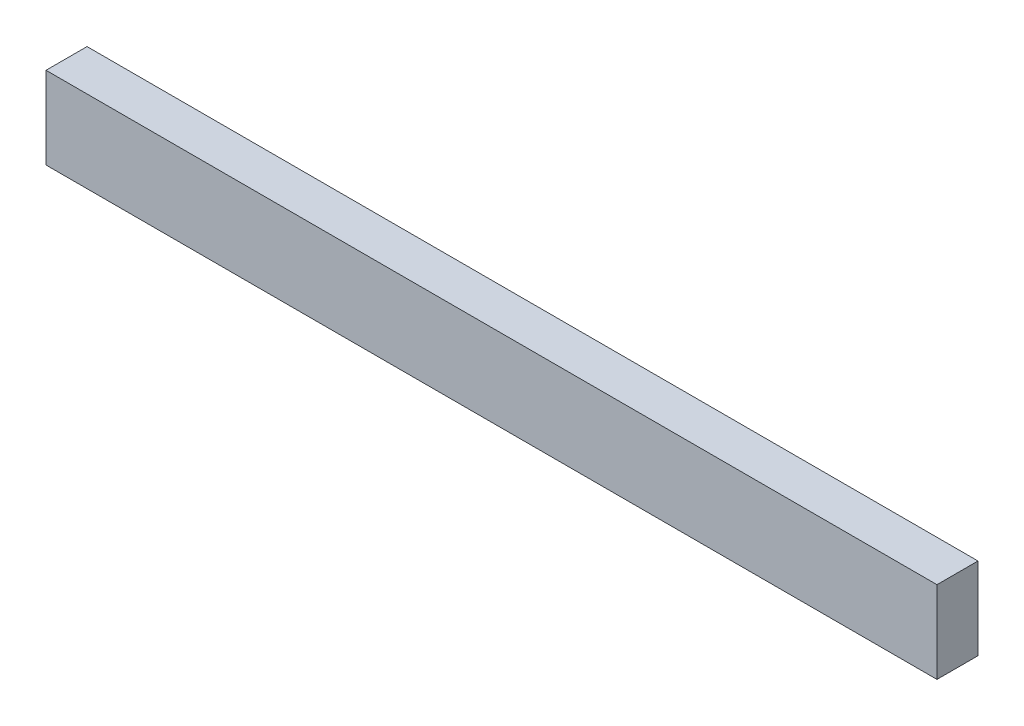
ISO-10303-21;
HEADER;
FILE_DESCRIPTION(('STEP AP214'),'2;1');
FILE_NAME('part.step','',(''),(''),'','','');
FILE_SCHEMA(('AUTOMOTIVE_DESIGN { 1 0 10303 214 1 1 1 1 }'));
ENDSEC;
DATA;
#1=APPLICATION_CONTEXT('core data for automotive mechanical design processes');
#2=APPLICATION_PROTOCOL_DEFINITION('international standard','automotive_design',2000,#1);
#3=PRODUCT_CONTEXT('',#1,'mechanical');
#4=PRODUCT('Part','Part','',(#3));
#5=PRODUCT_RELATED_PRODUCT_CATEGORY('part','',(#4));
#6=PRODUCT_DEFINITION_FORMATION('','',#4);
#7=PRODUCT_DEFINITION_CONTEXT('part definition',#1,'design');
#8=PRODUCT_DEFINITION('design','',#6,#7);
#9=PRODUCT_DEFINITION_SHAPE('','',#8);
#10=(LENGTH_UNIT() NAMED_UNIT(*) SI_UNIT(.MILLI.,.METRE.));
#11=(NAMED_UNIT(*) PLANE_ANGLE_UNIT() SI_UNIT($,.RADIAN.));
#12=(NAMED_UNIT(*) SI_UNIT($,.STERADIAN.) SOLID_ANGLE_UNIT());
#13=UNCERTAINTY_MEASURE_WITH_UNIT(LENGTH_MEASURE(1.E-05),#10,'distance_accuracy_value','');
#14=(GEOMETRIC_REPRESENTATION_CONTEXT(3) GLOBAL_UNCERTAINTY_ASSIGNED_CONTEXT((#13)) GLOBAL_UNIT_ASSIGNED_CONTEXT((#10,
#11,#12)) REPRESENTATION_CONTEXT('',''));
#15=CARTESIAN_POINT('',(0.,0.,0.));
#16=DIRECTION('',(0.,0.,1.));
#17=DIRECTION('',(1.,0.,0.));
#18=AXIS2_PLACEMENT_3D('',#15,#16,#17);
#19=CARTESIAN_POINT('',(0.,0.,5.55625));
#20=DIRECTION('',(-1.,0.,0.));
#21=DIRECTION('',(0.,0.,1.));
#22=AXIS2_PLACEMENT_3D('',#19,#20,#21);
#23=PLANE('',#22);
#24=DIRECTION('',(0.,1.,0.));
#25=VECTOR('',#24,1.);
#26=CARTESIAN_POINT('',(0.,0.,0.));
#27=LINE('',#26,#25);
#28=CARTESIAN_POINT('',(0.,0.,0.));
#29=VERTEX_POINT('',#28);
#30=CARTESIAN_POINT('',(0.,11.1125,0.));
#31=VERTEX_POINT('',#30);
#32=EDGE_CURVE('E96',#29,#31,#27,.T.);
#33=ORIENTED_EDGE('',*,*,#32,.T.);
#34=DIRECTION('',(0.,0.,-1.));
#35=VECTOR('',#34,1.);
#36=CARTESIAN_POINT('',(0.,11.1125,5.55625));
#37=LINE('',#36,#35);
#38=CARTESIAN_POINT('',(0.,11.1125,5.55625));
#39=VERTEX_POINT('',#38);
#40=EDGE_CURVE('E11',#39,#31,#37,.T.);
#41=ORIENTED_EDGE('',*,*,#40,.F.);
#42=DIRECTION('',(0.,1.,0.));
#43=VECTOR('',#42,1.);
#44=CARTESIAN_POINT('',(0.,0.,5.55625));
#45=LINE('',#44,#43);
#46=CARTESIAN_POINT('',(0.,0.,5.55625));
#47=VERTEX_POINT('',#46);
#48=EDGE_CURVE('E84',#47,#39,#45,.T.);
#49=ORIENTED_EDGE('',*,*,#48,.F.);
#50=DIRECTION('',(0.,0.,-1.));
#51=VECTOR('',#50,1.);
#52=CARTESIAN_POINT('',(0.,0.,5.55625));
#53=LINE('',#52,#51);
#54=EDGE_CURVE('E92',#47,#29,#53,.T.);
#55=ORIENTED_EDGE('',*,*,#54,.T.);
#56=EDGE_LOOP('',(#33,#41,#49,#55));
#57=FACE_BOUND('',#56,.T.);
#58=ADVANCED_FACE('F33',(#57),#23,.F.);
#59=CARTESIAN_POINT('',(0.,11.1125,5.55625));
#60=DIRECTION('',(0.,-1.,0.));
#61=DIRECTION('',(1.,0.,0.));
#62=AXIS2_PLACEMENT_3D('',#59,#60,#61);
#63=PLANE('',#62);
#64=DIRECTION('',(-1.,0.,0.));
#65=VECTOR('',#64,1.);
#66=CARTESIAN_POINT('',(0.,11.1125,0.));
#67=LINE('',#66,#65);
#68=CARTESIAN_POINT('',(-120.65,11.1125,0.));
#69=VERTEX_POINT('',#68);
#70=EDGE_CURVE('E88',#31,#69,#67,.T.);
#71=ORIENTED_EDGE('',*,*,#70,.T.);
#72=DIRECTION('',(0.,0.,-1.));
#73=VECTOR('',#72,1.);
#74=CARTESIAN_POINT('',(-120.65,11.1125,5.55625));
#75=LINE('',#74,#73);
#76=CARTESIAN_POINT('',(-120.65,11.1125,5.55625));
#77=VERTEX_POINT('',#76);
#78=EDGE_CURVE('E41',#77,#69,#75,.T.);
#79=ORIENTED_EDGE('',*,*,#78,.F.);
#80=DIRECTION('',(-1.,0.,0.));
#81=VECTOR('',#80,1.);
#82=CARTESIAN_POINT('',(0.,11.1125,5.55625));
#83=LINE('',#82,#81);
#84=EDGE_CURVE('E79',#39,#77,#83,.T.);
#85=ORIENTED_EDGE('',*,*,#84,.F.);
#86=ORIENTED_EDGE('',*,*,#40,.T.);
#87=EDGE_LOOP('',(#71,#79,#85,#86));
#88=FACE_BOUND('',#87,.T.);
#89=ADVANCED_FACE('F87',(#88),#63,.F.);
#90=CARTESIAN_POINT('',(-120.65,0.,5.55625));
#91=DIRECTION('',(1.,0.,0.));
#92=DIRECTION('',(0.,0.,-1.));
#93=AXIS2_PLACEMENT_3D('',#90,#91,#92);
#94=PLANE('',#93);
#95=DIRECTION('',(0.,-1.,0.));
#96=VECTOR('',#95,1.);
#97=CARTESIAN_POINT('',(-120.65,0.,0.));
#98=LINE('',#97,#96);
#99=CARTESIAN_POINT('',(-120.65,0.,0.));
#100=VERTEX_POINT('',#99);
#101=EDGE_CURVE('E66',#69,#100,#98,.T.);
#102=ORIENTED_EDGE('',*,*,#101,.T.);
#103=DIRECTION('',(0.,0.,-1.));
#104=VECTOR('',#103,1.);
#105=CARTESIAN_POINT('',(-120.65,0.,5.55625));
#106=LINE('',#105,#104);
#107=CARTESIAN_POINT('',(-120.65,0.,5.55625));
#108=VERTEX_POINT('',#107);
#109=EDGE_CURVE('E89',#108,#100,#106,.T.);
#110=ORIENTED_EDGE('',*,*,#109,.F.);
#111=DIRECTION('',(0.,-1.,0.));
#112=VECTOR('',#111,1.);
#113=CARTESIAN_POINT('',(-120.65,0.,5.55625));
#114=LINE('',#113,#112);
#115=EDGE_CURVE('E82',#77,#108,#114,.T.);
#116=ORIENTED_EDGE('',*,*,#115,.F.);
#117=ORIENTED_EDGE('',*,*,#78,.T.);
#118=EDGE_LOOP('',(#102,#110,#116,#117));
#119=FACE_BOUND('',#118,.T.);
#120=ADVANCED_FACE('F90',(#119),#94,.F.);
#121=CARTESIAN_POINT('',(0.,0.,5.55625));
#122=DIRECTION('',(0.,1.,0.));
#123=DIRECTION('',(-1.,0.,0.));
#124=AXIS2_PLACEMENT_3D('',#121,#122,#123);
#125=PLANE('',#124);
#126=DIRECTION('',(1.,0.,0.));
#127=VECTOR('',#126,1.);
#128=CARTESIAN_POINT('',(0.,0.,0.));
#129=LINE('',#128,#127);
#130=EDGE_CURVE('E72',#100,#29,#129,.T.);
#131=ORIENTED_EDGE('',*,*,#130,.T.);
#132=ORIENTED_EDGE('',*,*,#54,.F.);
#133=DIRECTION('',(1.,0.,0.));
#134=VECTOR('',#133,1.);
#135=CARTESIAN_POINT('',(0.,0.,5.55625));
#136=LINE('',#135,#134);
#137=EDGE_CURVE('E49',#108,#47,#136,.T.);
#138=ORIENTED_EDGE('',*,*,#137,.F.);
#139=ORIENTED_EDGE('',*,*,#109,.T.);
#140=EDGE_LOOP('',(#131,#132,#138,#139));
#141=FACE_BOUND('',#140,.T.);
#142=ADVANCED_FACE('F103',(#141),#125,.F.);
#143=CARTESIAN_POINT('',(0.,0.,5.55625));
#144=DIRECTION('',(0.,0.,1.));
#145=DIRECTION('',(1.,0.,0.));
#146=AXIS2_PLACEMENT_3D('',#143,#144,#145);
#147=PLANE('',#146);
#148=ORIENTED_EDGE('',*,*,#48,.T.);
#149=ORIENTED_EDGE('',*,*,#84,.T.);
#150=ORIENTED_EDGE('',*,*,#115,.T.);
#151=ORIENTED_EDGE('',*,*,#137,.T.);
#152=EDGE_LOOP('',(#148,#149,#150,#151));
#153=FACE_BOUND('',#152,.T.);
#154=ADVANCED_FACE('F80',(#153),#147,.T.);
#155=CARTESIAN_POINT('',(0.,0.,0.));
#156=DIRECTION('',(0.,0.,1.));
#157=DIRECTION('',(1.,0.,0.));
#158=AXIS2_PLACEMENT_3D('',#155,#156,#157);
#159=PLANE('',#158);
#160=ORIENTED_EDGE('',*,*,#32,.F.);
#161=ORIENTED_EDGE('',*,*,#130,.F.);
#162=ORIENTED_EDGE('',*,*,#101,.F.);
#163=ORIENTED_EDGE('',*,*,#70,.F.);
#164=EDGE_LOOP('',(#160,#161,#162,#163));
#165=FACE_BOUND('',#164,.T.);
#166=ADVANCED_FACE('F106',(#165),#159,.F.);
#167=CLOSED_SHELL('',(#58,#89,#120,#142,#154,#166));
#168=MANIFOLD_SOLID_BREP('B2',#167);
#169=ADVANCED_BREP_SHAPE_REPRESENTATION('',(#18,#168),#14);
#170=SHAPE_DEFINITION_REPRESENTATION(#9,#169);
ENDSEC;
END-ISO-10303-21;
